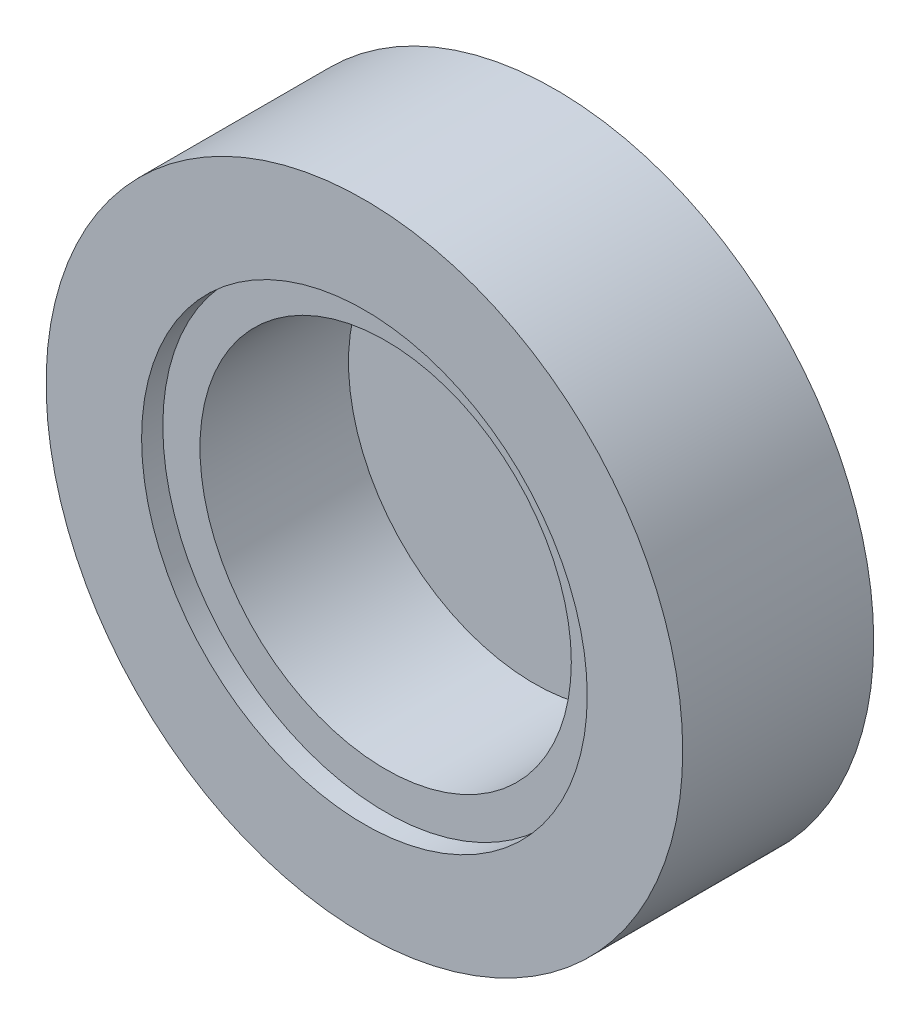
ISO-10303-21;
HEADER;
FILE_DESCRIPTION(('STEP AP214'),'2;1');
FILE_NAME('part.step','',(''),(''),'','','');
FILE_SCHEMA(('AUTOMOTIVE_DESIGN { 1 0 10303 214 1 1 1 1 }'));
ENDSEC;
DATA;
#1=APPLICATION_CONTEXT('core data for automotive mechanical design processes');
#2=APPLICATION_PROTOCOL_DEFINITION('international standard','automotive_design',2000,#1);
#3=PRODUCT_CONTEXT('',#1,'mechanical');
#4=PRODUCT('Part','Part','',(#3));
#5=PRODUCT_RELATED_PRODUCT_CATEGORY('part','',(#4));
#6=PRODUCT_DEFINITION_FORMATION('','',#4);
#7=PRODUCT_DEFINITION_CONTEXT('part definition',#1,'design');
#8=PRODUCT_DEFINITION('design','',#6,#7);
#9=PRODUCT_DEFINITION_SHAPE('','',#8);
#10=(LENGTH_UNIT() NAMED_UNIT(*) SI_UNIT(.MILLI.,.METRE.));
#11=(NAMED_UNIT(*) PLANE_ANGLE_UNIT() SI_UNIT($,.RADIAN.));
#12=(NAMED_UNIT(*) SI_UNIT($,.STERADIAN.) SOLID_ANGLE_UNIT());
#13=UNCERTAINTY_MEASURE_WITH_UNIT(LENGTH_MEASURE(1.E-05),#10,'distance_accuracy_value','');
#14=(GEOMETRIC_REPRESENTATION_CONTEXT(3) GLOBAL_UNCERTAINTY_ASSIGNED_CONTEXT((#13)) GLOBAL_UNIT_ASSIGNED_CONTEXT((#10,
#11,#12)) REPRESENTATION_CONTEXT('',''));
#15=CARTESIAN_POINT('',(0.,0.,0.));
#16=DIRECTION('',(0.,0.,1.));
#17=DIRECTION('',(1.,0.,0.));
#18=AXIS2_PLACEMENT_3D('',#15,#16,#17);
#19=CARTESIAN_POINT('',(0.,0.,18.));
#20=DIRECTION('',(0.,0.,-1.));
#21=DIRECTION('',(-1.,0.,0.));
#22=AXIS2_PLACEMENT_3D('',#19,#20,#21);
#23=CYLINDRICAL_SURFACE('',#22,30.);
#24=CARTESIAN_POINT('',(0.,0.,18.));
#25=DIRECTION('',(0.,0.,1.));
#26=DIRECTION('',(1.,0.,0.));
#27=AXIS2_PLACEMENT_3D('',#24,#25,#26);
#28=CIRCLE('',#27,30.);
#29=CARTESIAN_POINT('',(30.,0.,18.));
#30=VERTEX_POINT('',#29);
#31=EDGE_CURVE('E10',#30,#30,#28,.T.);
#32=ORIENTED_EDGE('',*,*,#31,.F.);
#33=EDGE_LOOP('',(#32));
#34=FACE_BOUND('',#33,.T.);
#35=CARTESIAN_POINT('',(0.,0.,0.));
#36=DIRECTION('',(0.,0.,1.));
#37=DIRECTION('',(1.,0.,0.));
#38=AXIS2_PLACEMENT_3D('',#35,#36,#37);
#39=CIRCLE('',#38,30.);
#40=CARTESIAN_POINT('',(30.,0.,0.));
#41=VERTEX_POINT('',#40);
#42=EDGE_CURVE('E45',#41,#41,#39,.T.);
#43=ORIENTED_EDGE('',*,*,#42,.T.);
#44=EDGE_LOOP('',(#43));
#45=FACE_BOUND('',#44,.T.);
#46=ADVANCED_FACE('F37',(#34,#45),#23,.T.);
#47=CARTESIAN_POINT('',(0.,0.,18.));
#48=DIRECTION('',(0.,0.,1.));
#49=DIRECTION('',(1.,0.,0.));
#50=AXIS2_PLACEMENT_3D('',#47,#48,#49);
#51=PLANE('',#50);
#52=CARTESIAN_POINT('',(0.,0.,18.));
#53=DIRECTION('',(0.,0.,1.));
#54=DIRECTION('',(1.,0.,0.));
#55=AXIS2_PLACEMENT_3D('',#52,#53,#54);
#56=CIRCLE('',#55,21.);
#57=CARTESIAN_POINT('',(21.,0.,18.));
#58=VERTEX_POINT('',#57);
#59=EDGE_CURVE('E56',#58,#58,#56,.T.);
#60=ORIENTED_EDGE('',*,*,#59,.F.);
#61=EDGE_LOOP('',(#60));
#62=FACE_BOUND('',#61,.T.);
#63=ORIENTED_EDGE('',*,*,#31,.T.);
#64=EDGE_LOOP('',(#63));
#65=FACE_BOUND('',#64,.T.);
#66=ADVANCED_FACE('F85',(#62,#65),#51,.T.);
#67=CARTESIAN_POINT('',(0.,0.,0.));
#68=DIRECTION('',(0.,0.,1.));
#69=DIRECTION('',(1.,0.,0.));
#70=AXIS2_PLACEMENT_3D('',#67,#68,#69);
#71=PLANE('',#70);
#72=ORIENTED_EDGE('',*,*,#42,.F.);
#73=EDGE_LOOP('',(#72));
#74=FACE_BOUND('',#73,.T.);
#75=ADVANCED_FACE('F90',(#74),#71,.F.);
#76=CARTESIAN_POINT('',(0.,0.,16.));
#77=DIRECTION('',(0.,0.,1.));
#78=DIRECTION('',(1.,0.,0.));
#79=AXIS2_PLACEMENT_3D('',#76,#77,#78);
#80=PLANE('',#79);
#81=CARTESIAN_POINT('',(0.,0.,16.));
#82=DIRECTION('',(0.,0.,1.));
#83=DIRECTION('',(1.,0.,0.));
#84=AXIS2_PLACEMENT_3D('',#81,#82,#83);
#85=CIRCLE('',#84,21.);
#86=CARTESIAN_POINT('',(21.,0.,16.));
#87=VERTEX_POINT('',#86);
#88=EDGE_CURVE('E60',#87,#87,#85,.T.);
#89=ORIENTED_EDGE('',*,*,#88,.T.);
#90=EDGE_LOOP('',(#89));
#91=FACE_BOUND('',#90,.T.);
#92=CARTESIAN_POINT('',(0.,0.,16.));
#93=DIRECTION('',(0.,0.,1.));
#94=DIRECTION('',(1.,0.,0.));
#95=AXIS2_PLACEMENT_3D('',#92,#93,#94);
#96=CIRCLE('',#95,17.5);
#97=CARTESIAN_POINT('',(17.5,0.,16.));
#98=VERTEX_POINT('',#97);
#99=EDGE_CURVE('E40',#98,#98,#96,.F.);
#100=ORIENTED_EDGE('',*,*,#99,.T.);
#101=EDGE_LOOP('',(#100));
#102=FACE_BOUND('',#101,.T.);
#103=ADVANCED_FACE('F69',(#91,#102),#80,.T.);
#104=CARTESIAN_POINT('',(0.,0.,16.));
#105=DIRECTION('',(0.,0.,1.));
#106=DIRECTION('',(1.,0.,0.));
#107=AXIS2_PLACEMENT_3D('',#104,#105,#106);
#108=CYLINDRICAL_SURFACE('',#107,21.);
#109=ORIENTED_EDGE('',*,*,#88,.F.);
#110=EDGE_LOOP('',(#109));
#111=FACE_BOUND('',#110,.T.);
#112=ORIENTED_EDGE('',*,*,#59,.T.);
#113=EDGE_LOOP('',(#112));
#114=FACE_BOUND('',#113,.T.);
#115=ADVANCED_FACE('F79',(#111,#114),#108,.F.);
#116=CARTESIAN_POINT('',(0.,0.,2.));
#117=DIRECTION('',(0.,0.,1.));
#118=DIRECTION('',(1.,0.,0.));
#119=AXIS2_PLACEMENT_3D('',#116,#117,#118);
#120=PLANE('',#119);
#121=CARTESIAN_POINT('',(0.,0.,2.));
#122=DIRECTION('',(0.,0.,1.));
#123=DIRECTION('',(1.,0.,0.));
#124=AXIS2_PLACEMENT_3D('',#121,#122,#123);
#125=CIRCLE('',#124,17.5);
#126=CARTESIAN_POINT('',(17.5,0.,2.));
#127=VERTEX_POINT('',#126);
#128=EDGE_CURVE('E51',#127,#127,#125,.T.);
#129=ORIENTED_EDGE('',*,*,#128,.T.);
#130=EDGE_LOOP('',(#129));
#131=FACE_BOUND('',#130,.T.);
#132=ADVANCED_FACE('F73',(#131),#120,.T.);
#133=CARTESIAN_POINT('',(0.,0.,2.));
#134=DIRECTION('',(0.,0.,1.));
#135=DIRECTION('',(1.,0.,0.));
#136=AXIS2_PLACEMENT_3D('',#133,#134,#135);
#137=CYLINDRICAL_SURFACE('',#136,17.5);
#138=ORIENTED_EDGE('',*,*,#128,.F.);
#139=EDGE_LOOP('',(#138));
#140=FACE_BOUND('',#139,.T.);
#141=ORIENTED_EDGE('',*,*,#99,.F.);
#142=EDGE_LOOP('',(#141));
#143=FACE_BOUND('',#142,.T.);
#144=ADVANCED_FACE('F71',(#140,#143),#137,.F.);
#145=CLOSED_SHELL('',(#46,#66,#75,#103,#115,#132,#144));
#146=MANIFOLD_SOLID_BREP('B2',#145);
#147=ADVANCED_BREP_SHAPE_REPRESENTATION('',(#18,#146),#14);
#148=SHAPE_DEFINITION_REPRESENTATION(#9,#147);
ENDSEC;
END-ISO-10303-21;
